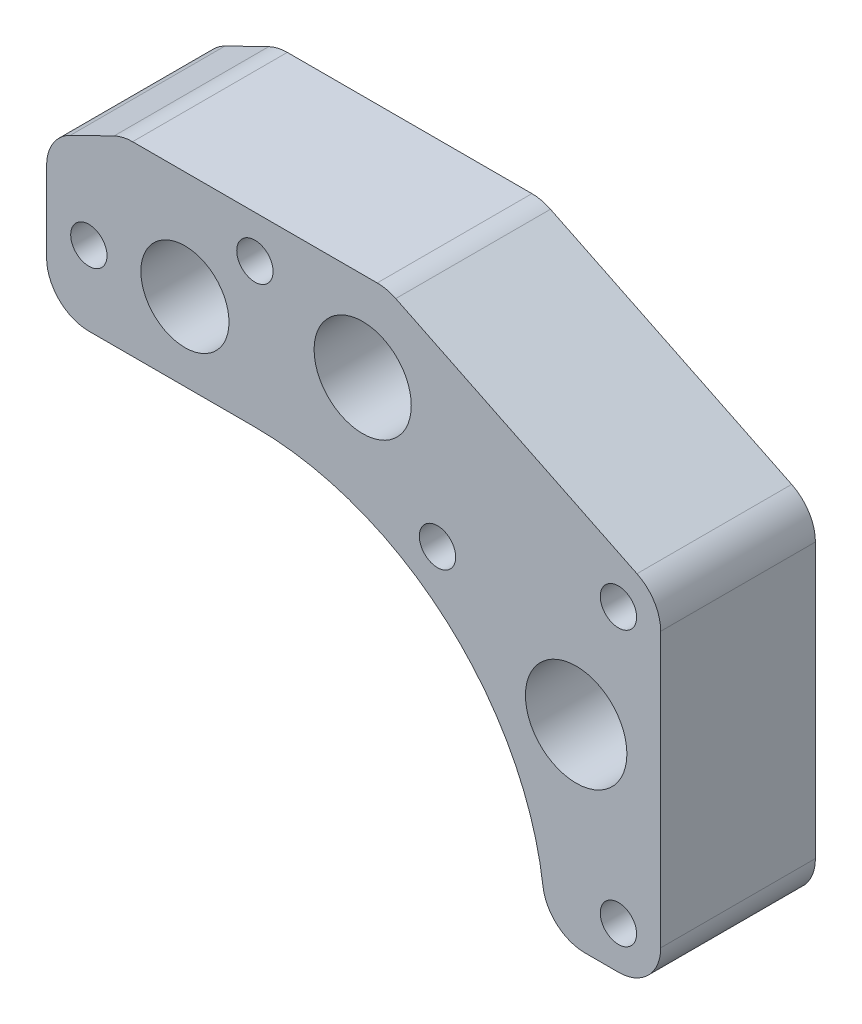
ISO-10303-21;
HEADER;
FILE_DESCRIPTION(('STEP AP214'),'2;1');
FILE_NAME('part.step','',(''),(''),'','','');
FILE_SCHEMA(('AUTOMOTIVE_DESIGN { 1 0 10303 214 1 1 1 1 }'));
ENDSEC;
DATA;
#1=APPLICATION_CONTEXT('core data for automotive mechanical design processes');
#2=APPLICATION_PROTOCOL_DEFINITION('international standard','automotive_design',2000,#1);
#3=PRODUCT_CONTEXT('',#1,'mechanical');
#4=PRODUCT('Part','Part','',(#3));
#5=PRODUCT_RELATED_PRODUCT_CATEGORY('part','',(#4));
#6=PRODUCT_DEFINITION_FORMATION('','',#4);
#7=PRODUCT_DEFINITION_CONTEXT('part definition',#1,'design');
#8=PRODUCT_DEFINITION('design','',#6,#7);
#9=PRODUCT_DEFINITION_SHAPE('','',#8);
#10=(LENGTH_UNIT() NAMED_UNIT(*) SI_UNIT(.MILLI.,.METRE.));
#11=(NAMED_UNIT(*) PLANE_ANGLE_UNIT() SI_UNIT($,.RADIAN.));
#12=(NAMED_UNIT(*) SI_UNIT($,.STERADIAN.) SOLID_ANGLE_UNIT());
#13=UNCERTAINTY_MEASURE_WITH_UNIT(LENGTH_MEASURE(1.E-05),#10,'distance_accuracy_value','');
#14=(GEOMETRIC_REPRESENTATION_CONTEXT(3) GLOBAL_UNCERTAINTY_ASSIGNED_CONTEXT((#13)) GLOBAL_UNIT_ASSIGNED_CONTEXT((#10,
#11,#12)) REPRESENTATION_CONTEXT('',''));
#15=CARTESIAN_POINT('',(0.,0.,0.));
#16=DIRECTION('',(0.,0.,1.));
#17=DIRECTION('',(1.,0.,0.));
#18=AXIS2_PLACEMENT_3D('',#15,#16,#17);
#19=CARTESIAN_POINT('',(0.,0.,18.3));
#20=DIRECTION('',(0.,0.,1.));
#21=DIRECTION('',(1.,0.,0.));
#22=AXIS2_PLACEMENT_3D('',#19,#20,#21);
#23=PLANE('',#22);
#24=CARTESIAN_POINT('',(37.9999999999999,22.8674987700887,18.3));
#25=DIRECTION('',(0.,0.,1.));
#26=DIRECTION('',(1.,0.,0.));
#27=AXIS2_PLACEMENT_3D('',#24,#25,#26);
#28=CIRCLE('',#27,6.);
#29=CARTESIAN_POINT('',(43.9999999999999,22.8674987700887,18.3));
#30=VERTEX_POINT('',#29);
#31=EDGE_CURVE('E316',#30,#30,#28,.T.);
#32=ORIENTED_EDGE('',*,*,#31,.F.);
#33=EDGE_LOOP('',(#32));
#34=FACE_BOUND('',#33,.T.);
#35=CARTESIAN_POINT('',(12.7474497451576,45.7908309577152,18.3));
#36=DIRECTION('',(0.,0.,1.));
#37=DIRECTION('',(1.,0.,0.));
#38=AXIS2_PLACEMENT_3D('',#35,#36,#37);
#39=CIRCLE('',#38,5.74744974515765);
#40=CARTESIAN_POINT('',(18.4948994903153,45.7908309577152,18.3));
#41=VERTEX_POINT('',#40);
#42=EDGE_CURVE('E323',#41,#41,#39,.T.);
#43=ORIENTED_EDGE('',*,*,#42,.F.);
#44=EDGE_LOOP('',(#43));
#45=FACE_BOUND('',#44,.T.);
#46=CARTESIAN_POINT('',(-8.27877346618895,43.5630042585863,18.3));
#47=DIRECTION('',(0.,0.,1.));
#48=DIRECTION('',(1.,0.,0.));
#49=AXIS2_PLACEMENT_3D('',#46,#47,#48);
#50=CIRCLE('',#49,5.21300425858627);
#51=CARTESIAN_POINT('',(-3.06576920760268,43.5630042585863,18.3));
#52=VERTEX_POINT('',#51);
#53=EDGE_CURVE('E326',#52,#52,#50,.T.);
#54=ORIENTED_EDGE('',*,*,#53,.F.);
#55=EDGE_LOOP('',(#54));
#56=FACE_BOUND('',#55,.T.);
#57=CARTESIAN_POINT('',(42.9999999999999,4.99999999999999,18.3));
#58=DIRECTION('',(0.,0.,1.));
#59=DIRECTION('',(1.,0.,0.));
#60=AXIS2_PLACEMENT_3D('',#57,#58,#59);
#61=CIRCLE('',#60,2.15);
#62=CARTESIAN_POINT('',(45.1499999999999,4.99999999999999,18.3));
#63=VERTEX_POINT('',#62);
#64=EDGE_CURVE('E181',#63,#63,#61,.T.);
#65=ORIENTED_EDGE('',*,*,#64,.F.);
#66=EDGE_LOOP('',(#65));
#67=FACE_BOUND('',#66,.T.);
#68=CARTESIAN_POINT('',(21.5974066129563,32.8933812125575,18.3));
#69=DIRECTION('',(0.,0.,1.));
#70=DIRECTION('',(1.,0.,0.));
#71=AXIS2_PLACEMENT_3D('',#68,#69,#70);
#72=CIRCLE('',#71,2.15);
#73=CARTESIAN_POINT('',(23.7474066129563,32.8933812125575,18.3));
#74=VERTEX_POINT('',#73);
#75=EDGE_CURVE('E293',#74,#74,#72,.T.);
#76=ORIENTED_EDGE('',*,*,#75,.F.);
#77=EDGE_LOOP('',(#76));
#78=FACE_BOUND('',#77,.T.);
#79=CARTESIAN_POINT('',(-19.6417777247752,43.1483468963964,18.3));
#80=DIRECTION('',(0.,0.,1.));
#81=DIRECTION('',(1.,0.,0.));
#82=AXIS2_PLACEMENT_3D('',#79,#80,#81);
#83=CIRCLE('',#82,2.15);
#84=CARTESIAN_POINT('',(-17.4917777247752,43.1483468963964,18.3));
#85=VERTEX_POINT('',#84);
#86=EDGE_CURVE('E296',#85,#85,#83,.T.);
#87=ORIENTED_EDGE('',*,*,#86,.F.);
#88=EDGE_LOOP('',(#87));
#89=FACE_BOUND('',#88,.T.);
#90=CARTESIAN_POINT('',(0.,51.3463053369318,18.3));
#91=DIRECTION('',(0.,0.,1.));
#92=DIRECTION('',(1.,0.,0.));
#93=AXIS2_PLACEMENT_3D('',#90,#91,#92);
#94=CIRCLE('',#93,2.15);
#95=CARTESIAN_POINT('',(2.15,51.3463053369318,18.3));
#96=VERTEX_POINT('',#95);
#97=EDGE_CURVE('E299',#96,#96,#94,.T.);
#98=ORIENTED_EDGE('',*,*,#97,.F.);
#99=EDGE_LOOP('',(#98));
#100=FACE_BOUND('',#99,.T.);
#101=CARTESIAN_POINT('',(42.9999999999999,37.4282952546554,18.3));
#102=DIRECTION('',(0.,0.,1.));
#103=DIRECTION('',(1.,0.,0.));
#104=AXIS2_PLACEMENT_3D('',#101,#102,#103);
#105=CIRCLE('',#104,2.15000000000001);
#106=CARTESIAN_POINT('',(45.1499999999999,37.4282952546554,18.3));
#107=VERTEX_POINT('',#106);
#108=EDGE_CURVE('E302',#107,#107,#105,.T.);
#109=ORIENTED_EDGE('',*,*,#108,.F.);
#110=EDGE_LOOP('',(#109));
#111=FACE_BOUND('',#110,.T.);
#112=DIRECTION('',(1.,0.,0.));
#113=VECTOR('',#112,1.);
#114=CARTESIAN_POINT('',(-24.6417777247752,56.3463053369318,18.3));
#115=LINE('',#114,#113);
#116=CARTESIAN_POINT('',(-14.468079331333,56.3463053369318,18.3));
#117=VERTEX_POINT('',#116);
#118=CARTESIAN_POINT('',(14.4680793313326,56.3463053369318,18.3));
#119=VERTEX_POINT('',#118);
#120=EDGE_CURVE('E187',#117,#119,#115,.T.);
#121=ORIENTED_EDGE('',*,*,#120,.F.);
#122=CARTESIAN_POINT('',(-14.468079331333,51.3463053369318,18.3));
#123=DIRECTION('',(0.,0.,1.));
#124=DIRECTION('',(1.,0.,0.));
#125=AXIS2_PLACEMENT_3D('',#122,#123,#124);
#126=CIRCLE('',#125,5.);
#127=CARTESIAN_POINT('',(-16.6601974914401,55.8401475651513,18.3));
#128=VERTEX_POINT('',#127);
#129=EDGE_CURVE('E221',#117,#128,#126,.T.);
#130=ORIENTED_EDGE('',*,*,#129,.T.);
#131=DIRECTION('',(0.898768445643901,0.438423632021413,0.));
#132=VECTOR('',#131,1.);
#133=CARTESIAN_POINT('',(-15.6225740592903,56.3463053369317,18.3));
#134=LINE('',#133,#132);
#135=CARTESIAN_POINT('',(-21.8338958848823,53.3163922512771,18.3));
#136=VERTEX_POINT('',#135);
#137=EDGE_CURVE('E193',#136,#128,#134,.T.);
#138=ORIENTED_EDGE('',*,*,#137,.F.);
#139=CARTESIAN_POINT('',(-19.6417777247752,48.8225500230576,18.3));
#140=DIRECTION('',(0.,0.,1.));
#141=DIRECTION('',(1.,0.,0.));
#142=AXIS2_PLACEMENT_3D('',#139,#140,#141);
#143=CIRCLE('',#142,5.);
#144=CARTESIAN_POINT('',(-24.6417777247752,48.8225500230576,18.3));
#145=VERTEX_POINT('',#144);
#146=EDGE_CURVE('E219',#136,#145,#143,.T.);
#147=ORIENTED_EDGE('',*,*,#146,.T.);
#148=DIRECTION('',(0.,-1.,0.));
#149=VECTOR('',#148,1.);
#150=CARTESIAN_POINT('',(-24.6417777247752,34.35,18.3));
#151=LINE('',#150,#149);
#152=CARTESIAN_POINT('',(-24.6417777247752,39.35,18.3));
#153=VERTEX_POINT('',#152);
#154=EDGE_CURVE('E177',#145,#153,#151,.T.);
#155=ORIENTED_EDGE('',*,*,#154,.T.);
#156=CARTESIAN_POINT('',(-19.6417777247752,39.35,18.3));
#157=DIRECTION('',(0.,0.,1.));
#158=DIRECTION('',(1.,0.,0.));
#159=AXIS2_PLACEMENT_3D('',#156,#157,#158);
#160=CIRCLE('',#159,5.);
#161=CARTESIAN_POINT('',(-19.6417777247752,34.35,18.3));
#162=VERTEX_POINT('',#161);
#163=EDGE_CURVE('E217',#153,#162,#160,.T.);
#164=ORIENTED_EDGE('',*,*,#163,.T.);
#165=DIRECTION('',(1.,0.,0.));
#166=VECTOR('',#165,1.);
#167=CARTESIAN_POINT('',(-56.,34.35,18.3));
#168=LINE('',#167,#166);
#169=CARTESIAN_POINT('',(0.,34.35,18.3));
#170=VERTEX_POINT('',#169);
#171=EDGE_CURVE('E175',#162,#170,#168,.T.);
#172=ORIENTED_EDGE('',*,*,#171,.T.);
#173=CARTESIAN_POINT('',(0.,0.,18.3));
#174=DIRECTION('',(0.,0.,1.));
#175=DIRECTION('',(1.,0.,0.));
#176=AXIS2_PLACEMENT_3D('',#173,#174,#175);
#177=CIRCLE('',#176,34.35);
#178=CARTESIAN_POINT('',(34.0715732473293,4.36467598475222,18.3));
#179=VERTEX_POINT('',#178);
#180=EDGE_CURVE('E168',#179,#170,#177,.T.);
#181=ORIENTED_EDGE('',*,*,#180,.F.);
#182=CARTESIAN_POINT('',(39.0310453357324,4.99999999999999,18.3));
#183=DIRECTION('',(0.,0.,1.));
#184=DIRECTION('',(1.,0.,0.));
#185=AXIS2_PLACEMENT_3D('',#182,#183,#184);
#186=CIRCLE('',#185,5.);
#187=CARTESIAN_POINT('',(39.0310453357324,0.,18.3));
#188=VERTEX_POINT('',#187);
#189=EDGE_CURVE('E215',#179,#188,#186,.T.);
#190=ORIENTED_EDGE('',*,*,#189,.T.);
#191=DIRECTION('',(-1.,0.,0.));
#192=VECTOR('',#191,1.);
#193=CARTESIAN_POINT('',(0.,0.,18.3));
#194=LINE('',#193,#192);
#195=CARTESIAN_POINT('',(42.9999999999999,0.,18.3));
#196=VERTEX_POINT('',#195);
#197=EDGE_CURVE('E153',#196,#188,#194,.T.);
#198=ORIENTED_EDGE('',*,*,#197,.F.);
#199=CARTESIAN_POINT('',(42.9999999999999,4.99999999999999,18.3));
#200=DIRECTION('',(0.,0.,1.));
#201=DIRECTION('',(1.,0.,0.));
#202=AXIS2_PLACEMENT_3D('',#199,#200,#201);
#203=CIRCLE('',#202,5.);
#204=CARTESIAN_POINT('',(47.9999999999999,4.99999999999998,18.3));
#205=VERTEX_POINT('',#204);
#206=EDGE_CURVE('E213',#196,#205,#203,.T.);
#207=ORIENTED_EDGE('',*,*,#206,.T.);
#208=DIRECTION('',(0.,-1.,0.));
#209=VECTOR('',#208,1.);
#210=CARTESIAN_POINT('',(47.9999999999999,0.,18.3));
#211=LINE('',#210,#209);
#212=CARTESIAN_POINT('',(48.,37.4282952546551,18.3));
#213=VERTEX_POINT('',#212);
#214=EDGE_CURVE('E199',#213,#205,#211,.T.);
#215=ORIENTED_EDGE('',*,*,#214,.F.);
#216=CARTESIAN_POINT('',(43.,37.4282952546551,18.3));
#217=DIRECTION('',(0.,0.,1.));
#218=DIRECTION('',(1.,0.,0.));
#219=AXIS2_PLACEMENT_3D('',#216,#217,#218);
#220=CIRCLE('',#219,5.);
#221=CARTESIAN_POINT('',(45.1921181601071,41.9221374828746,18.3));
#222=VERTEX_POINT('',#221);
#223=EDGE_CURVE('E209',#213,#222,#220,.T.);
#224=ORIENTED_EDGE('',*,*,#223,.T.);
#225=DIRECTION('',(0.8987684456439,-0.438423632021413,0.));
#226=VECTOR('',#225,1.);
#227=CARTESIAN_POINT('',(54.3152708960639,37.4718190750908,18.3));
#228=LINE('',#227,#226);
#229=CARTESIAN_POINT('',(16.6601974914397,55.8401475651513,18.3));
#230=VERTEX_POINT('',#229);
#231=EDGE_CURVE('E183',#230,#222,#228,.T.);
#232=ORIENTED_EDGE('',*,*,#231,.F.);
#233=CARTESIAN_POINT('',(14.4680793313326,51.3463053369318,18.3));
#234=DIRECTION('',(0.,0.,1.));
#235=DIRECTION('',(1.,0.,0.));
#236=AXIS2_PLACEMENT_3D('',#233,#234,#235);
#237=CIRCLE('',#236,5.);
#238=EDGE_CURVE('E211',#230,#119,#237,.T.);
#239=ORIENTED_EDGE('',*,*,#238,.T.);
#240=EDGE_LOOP('',(#121,#130,#138,#147,#155,#164,#172,#181,#190,#198,#207,#215,#224,#232,#239));
#241=FACE_BOUND('',#240,.T.);
#242=ADVANCED_FACE('F36',(#34,#45,#56,#67,#78,#89,#100,#111,#241),#23,.T.);
#243=CARTESIAN_POINT('',(0.,0.,0.));
#244=DIRECTION('',(0.,0.,1.));
#245=DIRECTION('',(1.,0.,0.));
#246=AXIS2_PLACEMENT_3D('',#243,#244,#245);
#247=PLANE('',#246);
#248=CARTESIAN_POINT('',(37.9999999999999,22.8674987700887,0.));
#249=DIRECTION('',(0.,0.,-1.));
#250=DIRECTION('',(-1.,0.,0.));
#251=AXIS2_PLACEMENT_3D('',#248,#249,#250);
#252=CIRCLE('',#251,6.);
#253=CARTESIAN_POINT('',(31.9999999999999,22.8674987700887,0.));
#254=VERTEX_POINT('',#253);
#255=EDGE_CURVE('E329',#254,#254,#252,.T.);
#256=ORIENTED_EDGE('',*,*,#255,.F.);
#257=EDGE_LOOP('',(#256));
#258=FACE_BOUND('',#257,.T.);
#259=CARTESIAN_POINT('',(12.7474497451576,45.7908309577152,0.));
#260=DIRECTION('',(0.,0.,-1.));
#261=DIRECTION('',(-1.,0.,0.));
#262=AXIS2_PLACEMENT_3D('',#259,#260,#261);
#263=CIRCLE('',#262,5.74744974515765);
#264=CARTESIAN_POINT('',(7.,45.7908309577152,0.));
#265=VERTEX_POINT('',#264);
#266=EDGE_CURVE('E333',#265,#265,#263,.T.);
#267=ORIENTED_EDGE('',*,*,#266,.F.);
#268=EDGE_LOOP('',(#267));
#269=FACE_BOUND('',#268,.T.);
#270=CARTESIAN_POINT('',(-8.27877346618895,43.5630042585863,0.));
#271=DIRECTION('',(0.,0.,-1.));
#272=DIRECTION('',(-1.,0.,0.));
#273=AXIS2_PLACEMENT_3D('',#270,#271,#272);
#274=CIRCLE('',#273,5.21300425858627);
#275=CARTESIAN_POINT('',(-13.4917777247752,43.5630042585863,0.));
#276=VERTEX_POINT('',#275);
#277=EDGE_CURVE('E330',#276,#276,#274,.T.);
#278=ORIENTED_EDGE('',*,*,#277,.F.);
#279=EDGE_LOOP('',(#278));
#280=FACE_BOUND('',#279,.T.);
#281=CARTESIAN_POINT('',(42.9999999999999,4.99999999999999,0.));
#282=DIRECTION('',(0.,0.,-1.));
#283=DIRECTION('',(-1.,0.,0.));
#284=AXIS2_PLACEMENT_3D('',#281,#282,#283);
#285=CIRCLE('',#284,2.15);
#286=CARTESIAN_POINT('',(40.8499999999999,4.99999999999999,0.));
#287=VERTEX_POINT('',#286);
#288=EDGE_CURVE('E305',#287,#287,#285,.T.);
#289=ORIENTED_EDGE('',*,*,#288,.F.);
#290=EDGE_LOOP('',(#289));
#291=FACE_BOUND('',#290,.T.);
#292=CARTESIAN_POINT('',(21.5974066129563,32.8933812125575,0.));
#293=DIRECTION('',(0.,0.,-1.));
#294=DIRECTION('',(-1.,0.,0.));
#295=AXIS2_PLACEMENT_3D('',#292,#293,#294);
#296=CIRCLE('',#295,2.15);
#297=CARTESIAN_POINT('',(19.4474066129563,32.8933812125575,0.));
#298=VERTEX_POINT('',#297);
#299=EDGE_CURVE('E313',#298,#298,#296,.T.);
#300=ORIENTED_EDGE('',*,*,#299,.F.);
#301=EDGE_LOOP('',(#300));
#302=FACE_BOUND('',#301,.T.);
#303=CARTESIAN_POINT('',(-19.6417777247752,43.1483468963964,0.));
#304=DIRECTION('',(0.,0.,-1.));
#305=DIRECTION('',(-1.,0.,0.));
#306=AXIS2_PLACEMENT_3D('',#303,#304,#305);
#307=CIRCLE('',#306,2.15);
#308=CARTESIAN_POINT('',(-21.7917777247752,43.1483468963964,0.));
#309=VERTEX_POINT('',#308);
#310=EDGE_CURVE('E310',#309,#309,#307,.T.);
#311=ORIENTED_EDGE('',*,*,#310,.F.);
#312=EDGE_LOOP('',(#311));
#313=FACE_BOUND('',#312,.T.);
#314=CARTESIAN_POINT('',(0.,51.3463053369318,0.));
#315=DIRECTION('',(0.,0.,-1.));
#316=DIRECTION('',(-1.,0.,0.));
#317=AXIS2_PLACEMENT_3D('',#314,#315,#316);
#318=CIRCLE('',#317,2.15);
#319=CARTESIAN_POINT('',(-2.15,51.3463053369318,0.));
#320=VERTEX_POINT('',#319);
#321=EDGE_CURVE('E306',#320,#320,#318,.T.);
#322=ORIENTED_EDGE('',*,*,#321,.F.);
#323=EDGE_LOOP('',(#322));
#324=FACE_BOUND('',#323,.T.);
#325=CARTESIAN_POINT('',(42.9999999999999,37.4282952546554,0.));
#326=DIRECTION('',(0.,0.,-1.));
#327=DIRECTION('',(-1.,0.,0.));
#328=AXIS2_PLACEMENT_3D('',#325,#326,#327);
#329=CIRCLE('',#328,2.15000000000001);
#330=CARTESIAN_POINT('',(40.8499999999999,37.4282952546554,0.));
#331=VERTEX_POINT('',#330);
#332=EDGE_CURVE('E309',#331,#331,#329,.T.);
#333=ORIENTED_EDGE('',*,*,#332,.F.);
#334=EDGE_LOOP('',(#333));
#335=FACE_BOUND('',#334,.T.);
#336=DIRECTION('',(0.898768445643901,0.438423632021413,0.));
#337=VECTOR('',#336,1.);
#338=CARTESIAN_POINT('',(-25.2056703507929,51.6716242191256,0.));
#339=LINE('',#338,#337);
#340=CARTESIAN_POINT('',(-21.8338958848823,53.3163922512771,0.));
#341=VERTEX_POINT('',#340);
#342=CARTESIAN_POINT('',(-16.6601974914401,55.8401475651514,0.));
#343=VERTEX_POINT('',#342);
#344=EDGE_CURVE('E163',#341,#343,#339,.T.);
#345=ORIENTED_EDGE('',*,*,#344,.T.);
#346=CARTESIAN_POINT('',(-14.468079331333,51.3463053369318,0.));
#347=DIRECTION('',(0.,0.,1.));
#348=DIRECTION('',(1.,0.,0.));
#349=AXIS2_PLACEMENT_3D('',#346,#347,#348);
#350=CIRCLE('',#349,5.);
#351=CARTESIAN_POINT('',(-14.468079331333,56.3463053369318,0.));
#352=VERTEX_POINT('',#351);
#353=EDGE_CURVE('E238',#343,#352,#350,.F.);
#354=ORIENTED_EDGE('',*,*,#353,.T.);
#355=DIRECTION('',(-1.,0.,0.));
#356=VECTOR('',#355,1.);
#357=CARTESIAN_POINT('',(-24.6417777247752,56.3463053369318,0.));
#358=LINE('',#357,#356);
#359=CARTESIAN_POINT('',(14.4680793313326,56.3463053369318,0.));
#360=VERTEX_POINT('',#359);
#361=EDGE_CURVE('E184',#360,#352,#358,.T.);
#362=ORIENTED_EDGE('',*,*,#361,.F.);
#363=CARTESIAN_POINT('',(14.4680793313326,51.3463053369318,0.));
#364=DIRECTION('',(0.,0.,1.));
#365=DIRECTION('',(1.,0.,0.));
#366=AXIS2_PLACEMENT_3D('',#363,#364,#365);
#367=CIRCLE('',#366,5.);
#368=CARTESIAN_POINT('',(16.6601974914397,55.8401475651513,0.));
#369=VERTEX_POINT('',#368);
#370=EDGE_CURVE('E230',#360,#369,#367,.F.);
#371=ORIENTED_EDGE('',*,*,#370,.T.);
#372=DIRECTION('',(-0.8987684456439,0.438423632021413,0.));
#373=VECTOR('',#372,1.);
#374=CARTESIAN_POINT('',(54.3152708960639,37.4718190750908,0.));
#375=LINE('',#374,#373);
#376=CARTESIAN_POINT('',(45.1921181601071,41.9221374828746,0.));
#377=VERTEX_POINT('',#376);
#378=EDGE_CURVE('E188',#377,#369,#375,.T.);
#379=ORIENTED_EDGE('',*,*,#378,.F.);
#380=CARTESIAN_POINT('',(43.,37.4282952546551,0.));
#381=DIRECTION('',(0.,0.,1.));
#382=DIRECTION('',(1.,0.,0.));
#383=AXIS2_PLACEMENT_3D('',#380,#381,#382);
#384=CIRCLE('',#383,5.);
#385=CARTESIAN_POINT('',(48.,37.4282952546551,0.));
#386=VERTEX_POINT('',#385);
#387=EDGE_CURVE('E228',#377,#386,#384,.F.);
#388=ORIENTED_EDGE('',*,*,#387,.T.);
#389=DIRECTION('',(0.,-1.,0.));
#390=VECTOR('',#389,1.);
#391=CARTESIAN_POINT('',(47.9999999999999,-1.39625077105295E-13,0.));
#392=LINE('',#391,#390);
#393=CARTESIAN_POINT('',(47.9999999999999,4.99999999999998,0.));
#394=VERTEX_POINT('',#393);
#395=EDGE_CURVE('E176',#386,#394,#392,.T.);
#396=ORIENTED_EDGE('',*,*,#395,.T.);
#397=CARTESIAN_POINT('',(42.9999999999999,4.99999999999999,0.));
#398=DIRECTION('',(0.,0.,1.));
#399=DIRECTION('',(1.,0.,0.));
#400=AXIS2_PLACEMENT_3D('',#397,#398,#399);
#401=CIRCLE('',#400,5.);
#402=CARTESIAN_POINT('',(42.9999999999999,0.,0.));
#403=VERTEX_POINT('',#402);
#404=EDGE_CURVE('E232',#394,#403,#401,.F.);
#405=ORIENTED_EDGE('',*,*,#404,.T.);
#406=DIRECTION('',(-1.,0.,0.));
#407=VECTOR('',#406,1.);
#408=CARTESIAN_POINT('',(0.,0.,0.));
#409=LINE('',#408,#407);
#410=CARTESIAN_POINT('',(39.0310453357324,0.,0.));
#411=VERTEX_POINT('',#410);
#412=EDGE_CURVE('E164',#403,#411,#409,.T.);
#413=ORIENTED_EDGE('',*,*,#412,.T.);
#414=CARTESIAN_POINT('',(39.0310453357324,4.99999999999999,0.));
#415=DIRECTION('',(0.,0.,1.));
#416=DIRECTION('',(1.,0.,0.));
#417=AXIS2_PLACEMENT_3D('',#414,#415,#416);
#418=CIRCLE('',#417,5.);
#419=CARTESIAN_POINT('',(34.0715732473293,4.36467598475222,0.));
#420=VERTEX_POINT('',#419);
#421=EDGE_CURVE('E160',#411,#420,#418,.F.);
#422=ORIENTED_EDGE('',*,*,#421,.T.);
#423=CARTESIAN_POINT('',(0.,0.,0.));
#424=DIRECTION('',(0.,0.,1.));
#425=DIRECTION('',(1.,0.,0.));
#426=AXIS2_PLACEMENT_3D('',#423,#424,#425);
#427=CIRCLE('',#426,34.35);
#428=CARTESIAN_POINT('',(0.,34.35,0.));
#429=VERTEX_POINT('',#428);
#430=EDGE_CURVE('E156',#420,#429,#427,.T.);
#431=ORIENTED_EDGE('',*,*,#430,.T.);
#432=DIRECTION('',(1.,0.,0.));
#433=VECTOR('',#432,1.);
#434=CARTESIAN_POINT('',(-56.,34.35,0.));
#435=LINE('',#434,#433);
#436=CARTESIAN_POINT('',(-19.6417777247752,34.35,0.));
#437=VERTEX_POINT('',#436);
#438=EDGE_CURVE('E144',#437,#429,#435,.T.);
#439=ORIENTED_EDGE('',*,*,#438,.F.);
#440=CARTESIAN_POINT('',(-19.6417777247752,39.35,0.));
#441=DIRECTION('',(0.,0.,1.));
#442=DIRECTION('',(1.,0.,0.));
#443=AXIS2_PLACEMENT_3D('',#440,#441,#442);
#444=CIRCLE('',#443,5.);
#445=CARTESIAN_POINT('',(-24.6417777247752,39.35,0.));
#446=VERTEX_POINT('',#445);
#447=EDGE_CURVE('E51',#437,#446,#444,.F.);
#448=ORIENTED_EDGE('',*,*,#447,.T.);
#449=DIRECTION('',(0.,-1.,0.));
#450=VECTOR('',#449,1.);
#451=CARTESIAN_POINT('',(-24.6417777247752,34.35,0.));
#452=LINE('',#451,#450);
#453=CARTESIAN_POINT('',(-24.6417777247752,48.8225500230576,0.));
#454=VERTEX_POINT('',#453);
#455=EDGE_CURVE('E152',#454,#446,#452,.T.);
#456=ORIENTED_EDGE('',*,*,#455,.F.);
#457=CARTESIAN_POINT('',(-19.6417777247752,48.8225500230576,0.));
#458=DIRECTION('',(0.,0.,1.));
#459=DIRECTION('',(1.,0.,0.));
#460=AXIS2_PLACEMENT_3D('',#457,#458,#459);
#461=CIRCLE('',#460,5.);
#462=EDGE_CURVE('E236',#454,#341,#461,.F.);
#463=ORIENTED_EDGE('',*,*,#462,.T.);
#464=EDGE_LOOP('',(#345,#354,#362,#371,#379,#388,#396,#405,#413,#422,#431,#439,#448,#456,#463));
#465=FACE_BOUND('',#464,.T.);
#466=ADVANCED_FACE('F158',(#258,#269,#280,#291,#302,#313,#324,#335,#465),#247,.F.);
#467=CARTESIAN_POINT('',(0.,0.,18.3));
#468=DIRECTION('',(0.,0.,-1.));
#469=DIRECTION('',(-1.,0.,0.));
#470=AXIS2_PLACEMENT_3D('',#467,#468,#469);
#471=CYLINDRICAL_SURFACE('',#470,34.35);
#472=ORIENTED_EDGE('',*,*,#430,.F.);
#473=DIRECTION('',(0.,0.,-1.));
#474=VECTOR('',#473,1.);
#475=CARTESIAN_POINT('',(34.0715732473293,4.36467598475222,18.3));
#476=LINE('',#475,#474);
#477=EDGE_CURVE('E250',#420,#179,#476,.F.);
#478=ORIENTED_EDGE('',*,*,#477,.T.);
#479=ORIENTED_EDGE('',*,*,#180,.T.);
#480=DIRECTION('',(0.,0.,-1.));
#481=VECTOR('',#480,1.);
#482=CARTESIAN_POINT('',(0.,34.35,83.9956809843691));
#483=LINE('',#482,#481);
#484=EDGE_CURVE('E149',#170,#429,#483,.T.);
#485=ORIENTED_EDGE('',*,*,#484,.T.);
#486=EDGE_LOOP('',(#472,#478,#479,#485));
#487=FACE_BOUND('',#486,.T.);
#488=ADVANCED_FACE('F166',(#487),#471,.F.);
#489=CARTESIAN_POINT('',(0.,0.,18.3));
#490=DIRECTION('',(0.,-1.,0.));
#491=DIRECTION('',(1.,0.,0.));
#492=AXIS2_PLACEMENT_3D('',#489,#490,#491);
#493=PLANE('',#492);
#494=ORIENTED_EDGE('',*,*,#197,.T.);
#495=DIRECTION('',(0.,0.,-1.));
#496=VECTOR('',#495,1.);
#497=CARTESIAN_POINT('',(39.0310453357324,0.,18.3));
#498=LINE('',#497,#496);
#499=EDGE_CURVE('E247',#188,#411,#498,.T.);
#500=ORIENTED_EDGE('',*,*,#499,.T.);
#501=ORIENTED_EDGE('',*,*,#412,.F.);
#502=DIRECTION('',(0.,0.,1.));
#503=VECTOR('',#502,1.);
#504=CARTESIAN_POINT('',(42.9999999999999,0.,18.3));
#505=LINE('',#504,#503);
#506=EDGE_CURVE('E244',#403,#196,#505,.T.);
#507=ORIENTED_EDGE('',*,*,#506,.T.);
#508=EDGE_LOOP('',(#494,#500,#501,#507));
#509=FACE_BOUND('',#508,.T.);
#510=ADVANCED_FACE('F284',(#509),#493,.T.);
#511=CARTESIAN_POINT('',(-56.,34.35,83.9956809843691));
#512=DIRECTION('',(0.,1.,0.));
#513=DIRECTION('',(0.,0.,1.));
#514=AXIS2_PLACEMENT_3D('',#511,#512,#513);
#515=PLANE('',#514);
#516=ORIENTED_EDGE('',*,*,#171,.F.);
#517=DIRECTION('',(0.,0.,-1.));
#518=VECTOR('',#517,1.);
#519=CARTESIAN_POINT('',(-19.6417777247752,34.35,83.9956809843691));
#520=LINE('',#519,#518);
#521=EDGE_CURVE('E151',#162,#437,#520,.T.);
#522=ORIENTED_EDGE('',*,*,#521,.T.);
#523=ORIENTED_EDGE('',*,*,#438,.T.);
#524=ORIENTED_EDGE('',*,*,#484,.F.);
#525=EDGE_LOOP('',(#516,#522,#523,#524));
#526=FACE_BOUND('',#525,.T.);
#527=ADVANCED_FACE('F147',(#526),#515,.F.);
#528=CARTESIAN_POINT('',(-24.6417777247752,34.35,77.5316053981771));
#529=DIRECTION('',(1.,0.,0.));
#530=DIRECTION('',(0.,0.,-1.));
#531=AXIS2_PLACEMENT_3D('',#528,#529,#530);
#532=PLANE('',#531);
#533=ORIENTED_EDGE('',*,*,#154,.F.);
#534=DIRECTION('',(0.,0.,1.));
#535=VECTOR('',#534,1.);
#536=CARTESIAN_POINT('',(-24.6417777247752,48.8225500230576,77.5316053981771));
#537=LINE('',#536,#535);
#538=EDGE_CURVE('E58',#145,#454,#537,.F.);
#539=ORIENTED_EDGE('',*,*,#538,.T.);
#540=ORIENTED_EDGE('',*,*,#455,.T.);
#541=DIRECTION('',(0.,0.,-1.));
#542=VECTOR('',#541,1.);
#543=CARTESIAN_POINT('',(-24.6417777247752,39.35,77.5316053981771));
#544=LINE('',#543,#542);
#545=EDGE_CURVE('E240',#446,#153,#544,.F.);
#546=ORIENTED_EDGE('',*,*,#545,.T.);
#547=EDGE_LOOP('',(#533,#539,#540,#546));
#548=FACE_BOUND('',#547,.T.);
#549=ADVANCED_FACE('F520',(#548),#532,.F.);
#550=CARTESIAN_POINT('',(54.3152708960639,37.4718190750908,-113.834157997121));
#551=DIRECTION('',(-0.438423632021413,-0.8987684456439,0.));
#552=DIRECTION('',(0.8987684456439,-0.438423632021413,0.));
#553=AXIS2_PLACEMENT_3D('',#550,#551,#552);
#554=PLANE('',#553);
#555=ORIENTED_EDGE('',*,*,#378,.T.);
#556=DIRECTION('',(0.,0.,1.));
#557=VECTOR('',#556,1.);
#558=CARTESIAN_POINT('',(16.6601974914397,55.8401475651513,-113.834157997121));
#559=LINE('',#558,#557);
#560=EDGE_CURVE('E11',#369,#230,#559,.T.);
#561=ORIENTED_EDGE('',*,*,#560,.T.);
#562=ORIENTED_EDGE('',*,*,#231,.T.);
#563=DIRECTION('',(0.,0.,-1.));
#564=VECTOR('',#563,1.);
#565=CARTESIAN_POINT('',(45.1921181601071,41.9221374828746,-113.834157997121));
#566=LINE('',#565,#564);
#567=EDGE_CURVE('E44',#222,#377,#566,.T.);
#568=ORIENTED_EDGE('',*,*,#567,.T.);
#569=EDGE_LOOP('',(#555,#561,#562,#568));
#570=FACE_BOUND('',#569,.T.);
#571=ADVANCED_FACE('F259',(#570),#554,.F.);
#572=CARTESIAN_POINT('',(-24.6417777247752,56.3463053369318,-113.834157997121));
#573=DIRECTION('',(0.,-1.,0.));
#574=DIRECTION('',(0.,0.,-1.));
#575=AXIS2_PLACEMENT_3D('',#572,#573,#574);
#576=PLANE('',#575);
#577=ORIENTED_EDGE('',*,*,#361,.T.);
#578=DIRECTION('',(0.,0.,1.));
#579=VECTOR('',#578,1.);
#580=CARTESIAN_POINT('',(-14.468079331333,56.3463053369318,-113.834157997121));
#581=LINE('',#580,#579);
#582=EDGE_CURVE('E206',#352,#117,#581,.T.);
#583=ORIENTED_EDGE('',*,*,#582,.T.);
#584=ORIENTED_EDGE('',*,*,#120,.T.);
#585=DIRECTION('',(0.,0.,1.));
#586=VECTOR('',#585,1.);
#587=CARTESIAN_POINT('',(14.4680793313326,56.3463053369318,-113.834157997121));
#588=LINE('',#587,#586);
#589=EDGE_CURVE('E204',#119,#360,#588,.F.);
#590=ORIENTED_EDGE('',*,*,#589,.T.);
#591=EDGE_LOOP('',(#577,#583,#584,#590));
#592=FACE_BOUND('',#591,.T.);
#593=ADVANCED_FACE('F533',(#592),#576,.F.);
#594=CARTESIAN_POINT('',(-15.6225740592903,56.3463053369317,-41.7));
#595=DIRECTION('',(0.438423632021413,-0.8987684456439,0.));
#596=DIRECTION('',(0.898768445643901,0.438423632021413,0.));
#597=AXIS2_PLACEMENT_3D('',#594,#595,#596);
#598=PLANE('',#597);
#599=ORIENTED_EDGE('',*,*,#137,.T.);
#600=DIRECTION('',(0.,0.,1.));
#601=VECTOR('',#600,1.);
#602=CARTESIAN_POINT('',(-16.6601974914401,55.8401475651513,-41.7));
#603=LINE('',#602,#601);
#604=EDGE_CURVE('E226',#128,#343,#603,.F.);
#605=ORIENTED_EDGE('',*,*,#604,.T.);
#606=ORIENTED_EDGE('',*,*,#344,.F.);
#607=DIRECTION('',(0.,0.,1.));
#608=VECTOR('',#607,1.);
#609=CARTESIAN_POINT('',(-21.8338958848823,53.3163922512771,-41.7));
#610=LINE('',#609,#608);
#611=EDGE_CURVE('E223',#341,#136,#610,.T.);
#612=ORIENTED_EDGE('',*,*,#611,.T.);
#613=EDGE_LOOP('',(#599,#605,#606,#612));
#614=FACE_BOUND('',#613,.T.);
#615=ADVANCED_FACE('F370',(#614),#598,.F.);
#616=CARTESIAN_POINT('',(47.9999999999999,0.,-85.7));
#617=DIRECTION('',(-1.,0.,0.));
#618=DIRECTION('',(0.,-1.,0.));
#619=AXIS2_PLACEMENT_3D('',#616,#617,#618);
#620=PLANE('',#619);
#621=ORIENTED_EDGE('',*,*,#214,.T.);
#622=DIRECTION('',(0.,0.,1.));
#623=VECTOR('',#622,1.);
#624=CARTESIAN_POINT('',(47.9999999999999,4.99999999999998,0.));
#625=LINE('',#624,#623);
#626=EDGE_CURVE('E254',#205,#394,#625,.F.);
#627=ORIENTED_EDGE('',*,*,#626,.T.);
#628=ORIENTED_EDGE('',*,*,#395,.F.);
#629=DIRECTION('',(0.,0.,-1.));
#630=VECTOR('',#629,1.);
#631=CARTESIAN_POINT('',(48.,37.4282952546551,-85.7));
#632=LINE('',#631,#630);
#633=EDGE_CURVE('E252',#386,#213,#632,.F.);
#634=ORIENTED_EDGE('',*,*,#633,.T.);
#635=EDGE_LOOP('',(#621,#627,#628,#634));
#636=FACE_BOUND('',#635,.T.);
#637=ADVANCED_FACE('F275',(#636),#620,.F.);
#638=CARTESIAN_POINT('',(42.9999999999999,37.4282952546554,144.));
#639=DIRECTION('',(0.,0.,-1.));
#640=DIRECTION('',(-1.,0.,0.));
#641=AXIS2_PLACEMENT_3D('',#638,#639,#640);
#642=CYLINDRICAL_SURFACE('',#641,2.15000000000001);
#643=ORIENTED_EDGE('',*,*,#108,.T.);
#644=EDGE_LOOP('',(#643));
#645=FACE_BOUND('',#644,.T.);
#646=ORIENTED_EDGE('',*,*,#332,.T.);
#647=EDGE_LOOP('',(#646));
#648=FACE_BOUND('',#647,.T.);
#649=ADVANCED_FACE('F358',(#645,#648),#642,.F.);
#650=CARTESIAN_POINT('',(0.,51.3463053369318,144.));
#651=DIRECTION('',(0.,0.,-1.));
#652=DIRECTION('',(-1.,0.,0.));
#653=AXIS2_PLACEMENT_3D('',#650,#651,#652);
#654=CYLINDRICAL_SURFACE('',#653,2.15);
#655=ORIENTED_EDGE('',*,*,#97,.T.);
#656=EDGE_LOOP('',(#655));
#657=FACE_BOUND('',#656,.T.);
#658=ORIENTED_EDGE('',*,*,#321,.T.);
#659=EDGE_LOOP('',(#658));
#660=FACE_BOUND('',#659,.T.);
#661=ADVANCED_FACE('F360',(#657,#660),#654,.F.);
#662=CARTESIAN_POINT('',(-19.6417777247752,43.1483468963964,144.));
#663=DIRECTION('',(0.,0.,-1.));
#664=DIRECTION('',(-1.,0.,0.));
#665=AXIS2_PLACEMENT_3D('',#662,#663,#664);
#666=CYLINDRICAL_SURFACE('',#665,2.15);
#667=ORIENTED_EDGE('',*,*,#86,.T.);
#668=EDGE_LOOP('',(#667));
#669=FACE_BOUND('',#668,.T.);
#670=ORIENTED_EDGE('',*,*,#310,.T.);
#671=EDGE_LOOP('',(#670));
#672=FACE_BOUND('',#671,.T.);
#673=ADVANCED_FACE('F367',(#669,#672),#666,.F.);
#674=CARTESIAN_POINT('',(21.5974066129563,32.8933812125575,144.));
#675=DIRECTION('',(0.,0.,-1.));
#676=DIRECTION('',(-1.,0.,0.));
#677=AXIS2_PLACEMENT_3D('',#674,#675,#676);
#678=CYLINDRICAL_SURFACE('',#677,2.15);
#679=ORIENTED_EDGE('',*,*,#75,.T.);
#680=EDGE_LOOP('',(#679));
#681=FACE_BOUND('',#680,.T.);
#682=ORIENTED_EDGE('',*,*,#299,.T.);
#683=EDGE_LOOP('',(#682));
#684=FACE_BOUND('',#683,.T.);
#685=ADVANCED_FACE('F418',(#681,#684),#678,.F.);
#686=CARTESIAN_POINT('',(42.9999999999999,4.99999999999999,144.));
#687=DIRECTION('',(0.,0.,-1.));
#688=DIRECTION('',(-1.,0.,0.));
#689=AXIS2_PLACEMENT_3D('',#686,#687,#688);
#690=CYLINDRICAL_SURFACE('',#689,2.15);
#691=ORIENTED_EDGE('',*,*,#64,.T.);
#692=EDGE_LOOP('',(#691));
#693=FACE_BOUND('',#692,.T.);
#694=ORIENTED_EDGE('',*,*,#288,.T.);
#695=EDGE_LOOP('',(#694));
#696=FACE_BOUND('',#695,.T.);
#697=ADVANCED_FACE('F385',(#693,#696),#690,.F.);
#698=CARTESIAN_POINT('',(-14.468079331333,51.3463053369318,-113.834157997121));
#699=DIRECTION('',(0.,0.,1.));
#700=DIRECTION('',(1.,0.,0.));
#701=AXIS2_PLACEMENT_3D('',#698,#699,#700);
#702=CYLINDRICAL_SURFACE('',#701,5.);
#703=ORIENTED_EDGE('',*,*,#353,.F.);
#704=ORIENTED_EDGE('',*,*,#604,.F.);
#705=ORIENTED_EDGE('',*,*,#129,.F.);
#706=ORIENTED_EDGE('',*,*,#582,.F.);
#707=EDGE_LOOP('',(#703,#704,#705,#706));
#708=FACE_BOUND('',#707,.T.);
#709=ADVANCED_FACE('F381',(#708),#702,.T.);
#710=CARTESIAN_POINT('',(-19.6417777247752,48.8225500230576,-41.7));
#711=DIRECTION('',(0.,0.,1.));
#712=DIRECTION('',(1.,0.,0.));
#713=AXIS2_PLACEMENT_3D('',#710,#711,#712);
#714=CYLINDRICAL_SURFACE('',#713,5.);
#715=ORIENTED_EDGE('',*,*,#462,.F.);
#716=ORIENTED_EDGE('',*,*,#538,.F.);
#717=ORIENTED_EDGE('',*,*,#146,.F.);
#718=ORIENTED_EDGE('',*,*,#611,.F.);
#719=EDGE_LOOP('',(#715,#716,#717,#718));
#720=FACE_BOUND('',#719,.T.);
#721=ADVANCED_FACE('F384',(#720),#714,.T.);
#722=CARTESIAN_POINT('',(-19.6417777247752,39.35,83.9956809843691));
#723=DIRECTION('',(0.,0.,-1.));
#724=DIRECTION('',(-1.,0.,0.));
#725=AXIS2_PLACEMENT_3D('',#722,#723,#724);
#726=CYLINDRICAL_SURFACE('',#725,5.);
#727=ORIENTED_EDGE('',*,*,#163,.F.);
#728=ORIENTED_EDGE('',*,*,#545,.F.);
#729=ORIENTED_EDGE('',*,*,#447,.F.);
#730=ORIENTED_EDGE('',*,*,#521,.F.);
#731=EDGE_LOOP('',(#727,#728,#729,#730));
#732=FACE_BOUND('',#731,.T.);
#733=ADVANCED_FACE('F389',(#732),#726,.T.);
#734=CARTESIAN_POINT('',(39.0310453357324,4.99999999999999,18.3));
#735=DIRECTION('',(0.,0.,-1.));
#736=DIRECTION('',(-1.,0.,0.));
#737=AXIS2_PLACEMENT_3D('',#734,#735,#736);
#738=CYLINDRICAL_SURFACE('',#737,5.);
#739=ORIENTED_EDGE('',*,*,#189,.F.);
#740=ORIENTED_EDGE('',*,*,#477,.F.);
#741=ORIENTED_EDGE('',*,*,#421,.F.);
#742=ORIENTED_EDGE('',*,*,#499,.F.);
#743=EDGE_LOOP('',(#739,#740,#741,#742));
#744=FACE_BOUND('',#743,.T.);
#745=ADVANCED_FACE('F288',(#744),#738,.T.);
#746=CARTESIAN_POINT('',(42.9999999999999,4.99999999999999,18.3));
#747=DIRECTION('',(0.,0.,-1.));
#748=DIRECTION('',(-1.,0.,0.));
#749=AXIS2_PLACEMENT_3D('',#746,#747,#748);
#750=CYLINDRICAL_SURFACE('',#749,5.);
#751=ORIENTED_EDGE('',*,*,#404,.F.);
#752=ORIENTED_EDGE('',*,*,#626,.F.);
#753=ORIENTED_EDGE('',*,*,#206,.F.);
#754=ORIENTED_EDGE('',*,*,#506,.F.);
#755=EDGE_LOOP('',(#751,#752,#753,#754));
#756=FACE_BOUND('',#755,.T.);
#757=ADVANCED_FACE('F281',(#756),#750,.T.);
#758=CARTESIAN_POINT('',(14.4680793313326,51.3463053369318,-113.834157997121));
#759=DIRECTION('',(0.,0.,1.));
#760=DIRECTION('',(1.,0.,0.));
#761=AXIS2_PLACEMENT_3D('',#758,#759,#760);
#762=CYLINDRICAL_SURFACE('',#761,5.);
#763=ORIENTED_EDGE('',*,*,#370,.F.);
#764=ORIENTED_EDGE('',*,*,#589,.F.);
#765=ORIENTED_EDGE('',*,*,#238,.F.);
#766=ORIENTED_EDGE('',*,*,#560,.F.);
#767=EDGE_LOOP('',(#763,#764,#765,#766));
#768=FACE_BOUND('',#767,.T.);
#769=ADVANCED_FACE('F269',(#768),#762,.T.);
#770=CARTESIAN_POINT('',(43.,37.4282952546551,-113.834157997121));
#771=DIRECTION('',(0.,0.,-1.));
#772=DIRECTION('',(-1.,0.,0.));
#773=AXIS2_PLACEMENT_3D('',#770,#771,#772);
#774=CYLINDRICAL_SURFACE('',#773,5.);
#775=ORIENTED_EDGE('',*,*,#223,.F.);
#776=ORIENTED_EDGE('',*,*,#633,.F.);
#777=ORIENTED_EDGE('',*,*,#387,.F.);
#778=ORIENTED_EDGE('',*,*,#567,.F.);
#779=EDGE_LOOP('',(#775,#776,#777,#778));
#780=FACE_BOUND('',#779,.T.);
#781=ADVANCED_FACE('F38',(#780),#774,.T.);
#782=CARTESIAN_POINT('',(-8.27877346618895,43.5630042585863,70.));
#783=DIRECTION('',(0.,0.,-1.));
#784=DIRECTION('',(-1.,0.,0.));
#785=AXIS2_PLACEMENT_3D('',#782,#783,#784);
#786=CYLINDRICAL_SURFACE('',#785,5.21300425858627);
#787=ORIENTED_EDGE('',*,*,#53,.T.);
#788=EDGE_LOOP('',(#787));
#789=FACE_BOUND('',#788,.T.);
#790=ORIENTED_EDGE('',*,*,#277,.T.);
#791=EDGE_LOOP('',(#790));
#792=FACE_BOUND('',#791,.T.);
#793=ADVANCED_FACE('F401',(#789,#792),#786,.F.);
#794=CARTESIAN_POINT('',(12.7474497451576,45.7908309577152,70.));
#795=DIRECTION('',(0.,0.,-1.));
#796=DIRECTION('',(-1.,0.,0.));
#797=AXIS2_PLACEMENT_3D('',#794,#795,#796);
#798=CYLINDRICAL_SURFACE('',#797,5.74744974515765);
#799=ORIENTED_EDGE('',*,*,#42,.T.);
#800=EDGE_LOOP('',(#799));
#801=FACE_BOUND('',#800,.T.);
#802=ORIENTED_EDGE('',*,*,#266,.T.);
#803=EDGE_LOOP('',(#802));
#804=FACE_BOUND('',#803,.T.);
#805=ADVANCED_FACE('F405',(#801,#804),#798,.F.);
#806=CARTESIAN_POINT('',(37.9999999999999,22.8674987700887,70.));
#807=DIRECTION('',(0.,0.,-1.));
#808=DIRECTION('',(-1.,0.,0.));
#809=AXIS2_PLACEMENT_3D('',#806,#807,#808);
#810=CYLINDRICAL_SURFACE('',#809,6.);
#811=ORIENTED_EDGE('',*,*,#31,.T.);
#812=EDGE_LOOP('',(#811));
#813=FACE_BOUND('',#812,.T.);
#814=ORIENTED_EDGE('',*,*,#255,.T.);
#815=EDGE_LOOP('',(#814));
#816=FACE_BOUND('',#815,.T.);
#817=ADVANCED_FACE('F339',(#813,#816),#810,.F.);
#818=CLOSED_SHELL('',(#242,#466,#488,#510,#527,#549,#571,#593,#615,#637,#649,#661,#673,#685,
#697,#709,#721,#733,#745,#757,#769,#781,#793,#805,#817));
#819=MANIFOLD_SOLID_BREP('B2',#818);
#820=ADVANCED_BREP_SHAPE_REPRESENTATION('',(#18,#819),#14);
#821=SHAPE_DEFINITION_REPRESENTATION(#9,#820);
ENDSEC;
END-ISO-10303-21;
